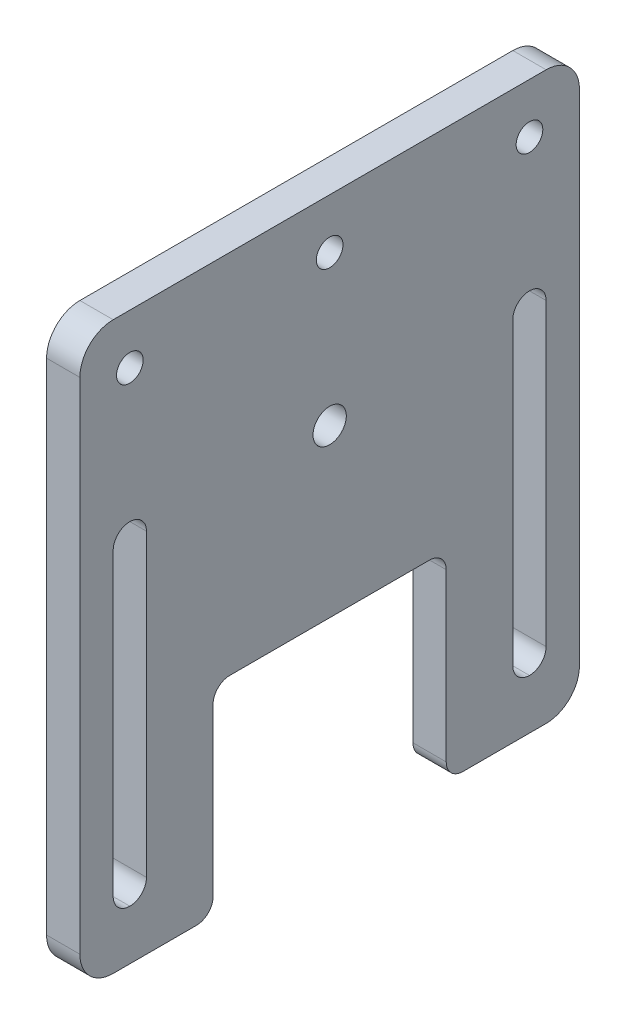
ISO-10303-21;
HEADER;
FILE_DESCRIPTION(('STEP AP214'),'2;1');
FILE_NAME('part.step','',(''),(''),'','','');
FILE_SCHEMA(('AUTOMOTIVE_DESIGN { 1 0 10303 214 1 1 1 1 }'));
ENDSEC;
DATA;
#1=APPLICATION_CONTEXT('core data for automotive mechanical design processes');
#2=APPLICATION_PROTOCOL_DEFINITION('international standard','automotive_design',2000,#1);
#3=PRODUCT_CONTEXT('',#1,'mechanical');
#4=PRODUCT('Part','Part','',(#3));
#5=PRODUCT_RELATED_PRODUCT_CATEGORY('part','',(#4));
#6=PRODUCT_DEFINITION_FORMATION('','',#4);
#7=PRODUCT_DEFINITION_CONTEXT('part definition',#1,'design');
#8=PRODUCT_DEFINITION('design','',#6,#7);
#9=PRODUCT_DEFINITION_SHAPE('','',#8);
#10=(LENGTH_UNIT() NAMED_UNIT(*) SI_UNIT(.MILLI.,.METRE.));
#11=(NAMED_UNIT(*) PLANE_ANGLE_UNIT() SI_UNIT($,.RADIAN.));
#12=(NAMED_UNIT(*) SI_UNIT($,.STERADIAN.) SOLID_ANGLE_UNIT());
#13=UNCERTAINTY_MEASURE_WITH_UNIT(LENGTH_MEASURE(1.E-05),#10,'distance_accuracy_value','');
#14=(GEOMETRIC_REPRESENTATION_CONTEXT(3) GLOBAL_UNCERTAINTY_ASSIGNED_CONTEXT((#13)) GLOBAL_UNIT_ASSIGNED_CONTEXT((#10,
#11,#12)) REPRESENTATION_CONTEXT('',''));
#15=CARTESIAN_POINT('',(0.,0.,0.));
#16=DIRECTION('',(0.,0.,1.));
#17=DIRECTION('',(1.,0.,0.));
#18=AXIS2_PLACEMENT_3D('',#15,#16,#17);
#19=CARTESIAN_POINT('',(10.,-85.,75.));
#20=DIRECTION('',(0.,1.,0.));
#21=DIRECTION('',(0.,0.,1.));
#22=AXIS2_PLACEMENT_3D('',#19,#20,#21);
#23=PLANE('',#22);
#24=DIRECTION('',(0.,0.,-1.));
#25=VECTOR('',#24,1.);
#26=CARTESIAN_POINT('',(0.,-85.,75.));
#27=LINE('',#26,#25);
#28=CARTESIAN_POINT('',(0.,-85.,-40.));
#29=VERTEX_POINT('',#28);
#30=CARTESIAN_POINT('',(0.,-85.,-65.));
#31=VERTEX_POINT('',#30);
#32=EDGE_CURVE('E299',#29,#31,#27,.T.);
#33=ORIENTED_EDGE('',*,*,#32,.T.);
#34=DIRECTION('',(-1.,0.,0.));
#35=VECTOR('',#34,1.);
#36=CARTESIAN_POINT('',(10.,-85.,-65.));
#37=LINE('',#36,#35);
#38=CARTESIAN_POINT('',(10.,-85.,-65.));
#39=VERTEX_POINT('',#38);
#40=EDGE_CURVE('E428',#31,#39,#37,.F.);
#41=ORIENTED_EDGE('',*,*,#40,.T.);
#42=DIRECTION('',(0.,0.,-1.));
#43=VECTOR('',#42,1.);
#44=CARTESIAN_POINT('',(10.,-85.,75.));
#45=LINE('',#44,#43);
#46=CARTESIAN_POINT('',(10.,-85.,-40.));
#47=VERTEX_POINT('',#46);
#48=EDGE_CURVE('E286',#47,#39,#45,.T.);
#49=ORIENTED_EDGE('',*,*,#48,.F.);
#50=DIRECTION('',(-1.,0.,0.));
#51=VECTOR('',#50,1.);
#52=CARTESIAN_POINT('',(10.,-85.,-40.));
#53=LINE('',#52,#51);
#54=EDGE_CURVE('E243',#47,#29,#53,.T.);
#55=ORIENTED_EDGE('',*,*,#54,.T.);
#56=EDGE_LOOP('',(#33,#41,#49,#55));
#57=FACE_BOUND('',#56,.T.);
#58=ADVANCED_FACE('F39',(#57),#23,.F.);
#59=CARTESIAN_POINT('',(10.,-85.,-75.));
#60=DIRECTION('',(0.,0.,1.));
#61=DIRECTION('',(1.,0.,0.));
#62=AXIS2_PLACEMENT_3D('',#59,#60,#61);
#63=PLANE('',#62);
#64=DIRECTION('',(0.,1.,0.));
#65=VECTOR('',#64,1.);
#66=CARTESIAN_POINT('',(10.,-85.,-75.));
#67=LINE('',#66,#65);
#68=CARTESIAN_POINT('',(10.,-75.,-75.));
#69=VERTEX_POINT('',#68);
#70=CARTESIAN_POINT('',(10.,75.,-75.));
#71=VERTEX_POINT('',#70);
#72=EDGE_CURVE('E279',#69,#71,#67,.T.);
#73=ORIENTED_EDGE('',*,*,#72,.F.);
#74=DIRECTION('',(-1.,0.,0.));
#75=VECTOR('',#74,1.);
#76=CARTESIAN_POINT('',(10.,-75.,-75.));
#77=LINE('',#76,#75);
#78=CARTESIAN_POINT('',(0.,-75.,-75.));
#79=VERTEX_POINT('',#78);
#80=EDGE_CURVE('E425',#69,#79,#77,.T.);
#81=ORIENTED_EDGE('',*,*,#80,.T.);
#82=DIRECTION('',(0.,1.,0.));
#83=VECTOR('',#82,1.);
#84=CARTESIAN_POINT('',(0.,-85.,-75.));
#85=LINE('',#84,#83);
#86=CARTESIAN_POINT('',(0.,75.,-75.));
#87=VERTEX_POINT('',#86);
#88=EDGE_CURVE('E290',#79,#87,#85,.T.);
#89=ORIENTED_EDGE('',*,*,#88,.T.);
#90=DIRECTION('',(-1.,0.,0.));
#91=VECTOR('',#90,1.);
#92=CARTESIAN_POINT('',(10.,75.,-75.));
#93=LINE('',#92,#91);
#94=EDGE_CURVE('E423',#87,#71,#93,.F.);
#95=ORIENTED_EDGE('',*,*,#94,.T.);
#96=EDGE_LOOP('',(#73,#81,#89,#95));
#97=FACE_BOUND('',#96,.T.);
#98=ADVANCED_FACE('F440',(#97),#63,.F.);
#99=CARTESIAN_POINT('',(10.,85.,75.));
#100=DIRECTION('',(0.,-1.,0.));
#101=DIRECTION('',(0.,0.,-1.));
#102=AXIS2_PLACEMENT_3D('',#99,#100,#101);
#103=PLANE('',#102);
#104=DIRECTION('',(0.,0.,1.));
#105=VECTOR('',#104,1.);
#106=CARTESIAN_POINT('',(10.,85.,75.));
#107=LINE('',#106,#105);
#108=CARTESIAN_POINT('',(10.,85.,-65.));
#109=VERTEX_POINT('',#108);
#110=CARTESIAN_POINT('',(10.,85.,65.));
#111=VERTEX_POINT('',#110);
#112=EDGE_CURVE('E281',#109,#111,#107,.T.);
#113=ORIENTED_EDGE('',*,*,#112,.F.);
#114=DIRECTION('',(-1.,0.,0.));
#115=VECTOR('',#114,1.);
#116=CARTESIAN_POINT('',(10.,85.,-65.));
#117=LINE('',#116,#115);
#118=CARTESIAN_POINT('',(0.,85.,-65.));
#119=VERTEX_POINT('',#118);
#120=EDGE_CURVE('E11',#109,#119,#117,.T.);
#121=ORIENTED_EDGE('',*,*,#120,.T.);
#122=DIRECTION('',(0.,0.,1.));
#123=VECTOR('',#122,1.);
#124=CARTESIAN_POINT('',(0.,85.,75.));
#125=LINE('',#124,#123);
#126=CARTESIAN_POINT('',(0.,85.,65.));
#127=VERTEX_POINT('',#126);
#128=EDGE_CURVE('E293',#119,#127,#125,.T.);
#129=ORIENTED_EDGE('',*,*,#128,.T.);
#130=DIRECTION('',(-1.,0.,0.));
#131=VECTOR('',#130,1.);
#132=CARTESIAN_POINT('',(10.,85.,65.));
#133=LINE('',#132,#131);
#134=EDGE_CURVE('E47',#127,#111,#133,.F.);
#135=ORIENTED_EDGE('',*,*,#134,.T.);
#136=EDGE_LOOP('',(#113,#121,#129,#135));
#137=FACE_BOUND('',#136,.T.);
#138=ADVANCED_FACE('F450',(#137),#103,.F.);
#139=CARTESIAN_POINT('',(10.,-85.,75.));
#140=DIRECTION('',(0.,0.,-1.));
#141=DIRECTION('',(-1.,0.,0.));
#142=AXIS2_PLACEMENT_3D('',#139,#140,#141);
#143=PLANE('',#142);
#144=DIRECTION('',(0.,-1.,0.));
#145=VECTOR('',#144,1.);
#146=CARTESIAN_POINT('',(0.,-85.,75.));
#147=LINE('',#146,#145);
#148=CARTESIAN_POINT('',(0.,75.,75.));
#149=VERTEX_POINT('',#148);
#150=CARTESIAN_POINT('',(0.,-75.,75.));
#151=VERTEX_POINT('',#150);
#152=EDGE_CURVE('E296',#149,#151,#147,.T.);
#153=ORIENTED_EDGE('',*,*,#152,.T.);
#154=DIRECTION('',(-1.,0.,0.));
#155=VECTOR('',#154,1.);
#156=CARTESIAN_POINT('',(10.,-75.,75.));
#157=LINE('',#156,#155);
#158=CARTESIAN_POINT('',(10.,-75.,75.));
#159=VERTEX_POINT('',#158);
#160=EDGE_CURVE('E414',#151,#159,#157,.F.);
#161=ORIENTED_EDGE('',*,*,#160,.T.);
#162=DIRECTION('',(0.,-1.,0.));
#163=VECTOR('',#162,1.);
#164=CARTESIAN_POINT('',(10.,-85.,75.));
#165=LINE('',#164,#163);
#166=CARTESIAN_POINT('',(10.,75.,75.));
#167=VERTEX_POINT('',#166);
#168=EDGE_CURVE('E284',#167,#159,#165,.T.);
#169=ORIENTED_EDGE('',*,*,#168,.F.);
#170=DIRECTION('',(-1.,0.,0.));
#171=VECTOR('',#170,1.);
#172=CARTESIAN_POINT('',(10.,75.,75.));
#173=LINE('',#172,#171);
#174=EDGE_CURVE('E411',#167,#149,#173,.T.);
#175=ORIENTED_EDGE('',*,*,#174,.T.);
#176=EDGE_LOOP('',(#153,#161,#169,#175));
#177=FACE_BOUND('',#176,.T.);
#178=ADVANCED_FACE('F457',(#177),#143,.F.);
#179=CARTESIAN_POINT('',(10.,-85.,65.));
#180=VERTEX_POINT('',#179);
#181=CARTESIAN_POINT('',(10.,-85.,40.));
#182=VERTEX_POINT('',#181);
#183=EDGE_CURVE('E287',#180,#182,#45,.T.);
#184=ORIENTED_EDGE('',*,*,#183,.F.);
#185=DIRECTION('',(-1.,0.,0.));
#186=VECTOR('',#185,1.);
#187=CARTESIAN_POINT('',(10.,-85.,65.));
#188=LINE('',#187,#186);
#189=CARTESIAN_POINT('',(0.,-85.,65.));
#190=VERTEX_POINT('',#189);
#191=EDGE_CURVE('E387',#180,#190,#188,.T.);
#192=ORIENTED_EDGE('',*,*,#191,.T.);
#193=CARTESIAN_POINT('',(0.,-85.,40.));
#194=VERTEX_POINT('',#193);
#195=EDGE_CURVE('E282',#190,#194,#27,.T.);
#196=ORIENTED_EDGE('',*,*,#195,.T.);
#197=DIRECTION('',(-1.,0.,0.));
#198=VECTOR('',#197,1.);
#199=CARTESIAN_POINT('',(10.,-85.,40.));
#200=LINE('',#199,#198);
#201=EDGE_CURVE('E257',#182,#194,#200,.T.);
#202=ORIENTED_EDGE('',*,*,#201,.F.);
#203=EDGE_LOOP('',(#184,#192,#196,#202));
#204=FACE_BOUND('',#203,.T.);
#205=ADVANCED_FACE('F466',(#204),#23,.F.);
#206=CARTESIAN_POINT('',(10.,0.,0.));
#207=DIRECTION('',(-1.,0.,0.));
#208=DIRECTION('',(0.,0.,1.));
#209=AXIS2_PLACEMENT_3D('',#206,#207,#208);
#210=PLANE('',#209);
#211=DIRECTION('',(0.,1.,0.));
#212=VECTOR('',#211,1.);
#213=CARTESIAN_POINT('',(10.,30.,65.));
#214=LINE('',#213,#212);
#215=CARTESIAN_POINT('',(10.,-65.,65.));
#216=VERTEX_POINT('',#215);
#217=CARTESIAN_POINT('',(10.,25.,65.));
#218=VERTEX_POINT('',#217);
#219=EDGE_CURVE('E834',#216,#218,#214,.T.);
#220=ORIENTED_EDGE('',*,*,#219,.T.);
#221=CARTESIAN_POINT('',(10.,25.,60.));
#222=DIRECTION('',(-1.,0.,0.));
#223=DIRECTION('',(0.,0.,1.));
#224=AXIS2_PLACEMENT_3D('',#221,#222,#223);
#225=CIRCLE('',#224,5.);
#226=CARTESIAN_POINT('',(10.,30.,60.));
#227=VERTEX_POINT('',#226);
#228=EDGE_CURVE('E377',#218,#227,#225,.T.);
#229=ORIENTED_EDGE('',*,*,#228,.T.);
#230=CARTESIAN_POINT('',(10.,25.,60.));
#231=DIRECTION('',(-1.,0.,0.));
#232=DIRECTION('',(0.,0.,1.));
#233=AXIS2_PLACEMENT_3D('',#230,#231,#232);
#234=CIRCLE('',#233,5.);
#235=CARTESIAN_POINT('',(10.,25.,55.));
#236=VERTEX_POINT('',#235);
#237=EDGE_CURVE('E373',#227,#236,#234,.T.);
#238=ORIENTED_EDGE('',*,*,#237,.T.);
#239=DIRECTION('',(0.,-1.,0.));
#240=VECTOR('',#239,1.);
#241=CARTESIAN_POINT('',(10.,30.,55.));
#242=LINE('',#241,#240);
#243=CARTESIAN_POINT('',(10.,-65.,55.));
#244=VERTEX_POINT('',#243);
#245=EDGE_CURVE('E839',#236,#244,#242,.T.);
#246=ORIENTED_EDGE('',*,*,#245,.T.);
#247=CARTESIAN_POINT('',(10.,-65.,60.));
#248=DIRECTION('',(-1.,0.,0.));
#249=DIRECTION('',(0.,0.,1.));
#250=AXIS2_PLACEMENT_3D('',#247,#248,#249);
#251=CIRCLE('',#250,5.);
#252=CARTESIAN_POINT('',(10.,-70.,60.));
#253=VERTEX_POINT('',#252);
#254=EDGE_CURVE('E385',#244,#253,#251,.T.);
#255=ORIENTED_EDGE('',*,*,#254,.T.);
#256=CARTESIAN_POINT('',(10.,-65.,60.));
#257=DIRECTION('',(-1.,0.,0.));
#258=DIRECTION('',(0.,0.,1.));
#259=AXIS2_PLACEMENT_3D('',#256,#257,#258);
#260=CIRCLE('',#259,5.);
#261=EDGE_CURVE('E381',#253,#216,#260,.T.);
#262=ORIENTED_EDGE('',*,*,#261,.T.);
#263=EDGE_LOOP('',(#220,#229,#238,#246,#255,#262));
#264=FACE_BOUND('',#263,.T.);
#265=CARTESIAN_POINT('',(10.,25.,0.));
#266=DIRECTION('',(-1.,0.,0.));
#267=DIRECTION('',(0.,0.,1.));
#268=AXIS2_PLACEMENT_3D('',#265,#266,#267);
#269=CIRCLE('',#268,5.);
#270=CARTESIAN_POINT('',(10.,25.,5.));
#271=VERTEX_POINT('',#270);
#272=EDGE_CURVE('E272',#271,#271,#269,.T.);
#273=ORIENTED_EDGE('',*,*,#272,.T.);
#274=EDGE_LOOP('',(#273));
#275=FACE_BOUND('',#274,.T.);
#276=CARTESIAN_POINT('',(10.,70.,0.));
#277=DIRECTION('',(-1.,0.,0.));
#278=DIRECTION('',(0.,0.,1.));
#279=AXIS2_PLACEMENT_3D('',#276,#277,#278);
#280=CIRCLE('',#279,4.00000000000001);
#281=CARTESIAN_POINT('',(10.,70.,4.));
#282=VERTEX_POINT('',#281);
#283=EDGE_CURVE('E237',#282,#282,#280,.T.);
#284=ORIENTED_EDGE('',*,*,#283,.T.);
#285=EDGE_LOOP('',(#284));
#286=FACE_BOUND('',#285,.T.);
#287=CARTESIAN_POINT('',(10.,70.,60.));
#288=DIRECTION('',(-1.,0.,0.));
#289=DIRECTION('',(0.,0.,1.));
#290=AXIS2_PLACEMENT_3D('',#287,#288,#289);
#291=CIRCLE('',#290,4.00000000000001);
#292=CARTESIAN_POINT('',(10.,70.,64.));
#293=VERTEX_POINT('',#292);
#294=EDGE_CURVE('E812',#293,#293,#291,.T.);
#295=ORIENTED_EDGE('',*,*,#294,.T.);
#296=EDGE_LOOP('',(#295));
#297=FACE_BOUND('',#296,.T.);
#298=DIRECTION('',(0.,-1.,0.));
#299=VECTOR('',#298,1.);
#300=CARTESIAN_POINT('',(10.,30.,-65.));
#301=LINE('',#300,#299);
#302=CARTESIAN_POINT('',(10.,25.,-65.));
#303=VERTEX_POINT('',#302);
#304=CARTESIAN_POINT('',(10.,-65.,-65.));
#305=VERTEX_POINT('',#304);
#306=EDGE_CURVE('E391',#303,#305,#301,.T.);
#307=ORIENTED_EDGE('',*,*,#306,.T.);
#308=CARTESIAN_POINT('',(10.,-65.,-60.));
#309=DIRECTION('',(-1.,0.,0.));
#310=DIRECTION('',(0.,0.,1.));
#311=AXIS2_PLACEMENT_3D('',#308,#309,#310);
#312=CIRCLE('',#311,5.);
#313=CARTESIAN_POINT('',(10.,-70.,-60.));
#314=VERTEX_POINT('',#313);
#315=EDGE_CURVE('E369',#305,#314,#312,.T.);
#316=ORIENTED_EDGE('',*,*,#315,.T.);
#317=CARTESIAN_POINT('',(10.,-65.,-60.));
#318=DIRECTION('',(-1.,0.,0.));
#319=DIRECTION('',(0.,0.,1.));
#320=AXIS2_PLACEMENT_3D('',#317,#318,#319);
#321=CIRCLE('',#320,5.);
#322=CARTESIAN_POINT('',(10.,-65.,-55.));
#323=VERTEX_POINT('',#322);
#324=EDGE_CURVE('E365',#314,#323,#321,.T.);
#325=ORIENTED_EDGE('',*,*,#324,.T.);
#326=DIRECTION('',(0.,1.,0.));
#327=VECTOR('',#326,1.);
#328=CARTESIAN_POINT('',(10.,30.,-55.));
#329=LINE('',#328,#327);
#330=CARTESIAN_POINT('',(10.,25.,-55.));
#331=VERTEX_POINT('',#330);
#332=EDGE_CURVE('E822',#323,#331,#329,.T.);
#333=ORIENTED_EDGE('',*,*,#332,.T.);
#334=CARTESIAN_POINT('',(10.,25.,-60.));
#335=DIRECTION('',(-1.,0.,0.));
#336=DIRECTION('',(0.,0.,1.));
#337=AXIS2_PLACEMENT_3D('',#334,#335,#336);
#338=CIRCLE('',#337,5.);
#339=CARTESIAN_POINT('',(10.,30.,-60.));
#340=VERTEX_POINT('',#339);
#341=EDGE_CURVE('E361',#331,#340,#338,.T.);
#342=ORIENTED_EDGE('',*,*,#341,.T.);
#343=CARTESIAN_POINT('',(10.,25.,-60.));
#344=DIRECTION('',(-1.,0.,0.));
#345=DIRECTION('',(0.,0.,1.));
#346=AXIS2_PLACEMENT_3D('',#343,#344,#345);
#347=CIRCLE('',#346,5.);
#348=EDGE_CURVE('E357',#340,#303,#347,.T.);
#349=ORIENTED_EDGE('',*,*,#348,.T.);
#350=EDGE_LOOP('',(#307,#316,#325,#333,#342,#349));
#351=FACE_BOUND('',#350,.T.);
#352=CARTESIAN_POINT('',(10.,70.,-60.));
#353=DIRECTION('',(-1.,0.,0.));
#354=DIRECTION('',(0.,0.,1.));
#355=AXIS2_PLACEMENT_3D('',#352,#353,#354);
#356=CIRCLE('',#355,4.00000000000001);
#357=CARTESIAN_POINT('',(10.,70.,-56.));
#358=VERTEX_POINT('',#357);
#359=EDGE_CURVE('E246',#358,#358,#356,.T.);
#360=ORIENTED_EDGE('',*,*,#359,.T.);
#361=EDGE_LOOP('',(#360));
#362=FACE_BOUND('',#361,.T.);
#363=ORIENTED_EDGE('',*,*,#168,.T.);
#364=CARTESIAN_POINT('',(10.,-75.,65.));
#365=DIRECTION('',(-1.,0.,0.));
#366=DIRECTION('',(0.,0.,1.));
#367=AXIS2_PLACEMENT_3D('',#364,#365,#366);
#368=CIRCLE('',#367,10.);
#369=EDGE_CURVE('E421',#159,#180,#368,.F.);
#370=ORIENTED_EDGE('',*,*,#369,.T.);
#371=ORIENTED_EDGE('',*,*,#183,.T.);
#372=CARTESIAN_POINT('',(10.,-80.,40.));
#373=DIRECTION('',(1.,0.,0.));
#374=DIRECTION('',(0.,0.,-1.));
#375=AXIS2_PLACEMENT_3D('',#372,#373,#374);
#376=CIRCLE('',#375,5.);
#377=CARTESIAN_POINT('',(10.,-80.,35.));
#378=VERTEX_POINT('',#377);
#379=EDGE_CURVE('E247',#182,#378,#376,.T.);
#380=ORIENTED_EDGE('',*,*,#379,.T.);
#381=DIRECTION('',(0.,1.,0.));
#382=VECTOR('',#381,1.);
#383=CARTESIAN_POINT('',(10.,-80.,35.));
#384=LINE('',#383,#382);
#385=CARTESIAN_POINT('',(10.,-30.,35.));
#386=VERTEX_POINT('',#385);
#387=EDGE_CURVE('E265',#378,#386,#384,.T.);
#388=ORIENTED_EDGE('',*,*,#387,.T.);
#389=CARTESIAN_POINT('',(10.,-30.,30.));
#390=DIRECTION('',(-1.,0.,0.));
#391=DIRECTION('',(0.,0.,1.));
#392=AXIS2_PLACEMENT_3D('',#389,#390,#391);
#393=CIRCLE('',#392,5.00000000000001);
#394=CARTESIAN_POINT('',(10.,-25.,30.));
#395=VERTEX_POINT('',#394);
#396=EDGE_CURVE('E262',#386,#395,#393,.T.);
#397=ORIENTED_EDGE('',*,*,#396,.T.);
#398=DIRECTION('',(0.,0.,-1.));
#399=VECTOR('',#398,1.);
#400=CARTESIAN_POINT('',(10.,-25.,-30.));
#401=LINE('',#400,#399);
#402=CARTESIAN_POINT('',(10.,-25.,-30.));
#403=VERTEX_POINT('',#402);
#404=EDGE_CURVE('E255',#395,#403,#401,.T.);
#405=ORIENTED_EDGE('',*,*,#404,.T.);
#406=CARTESIAN_POINT('',(10.,-30.,-30.));
#407=DIRECTION('',(-1.,0.,0.));
#408=DIRECTION('',(0.,0.,-1.));
#409=AXIS2_PLACEMENT_3D('',#406,#407,#408);
#410=CIRCLE('',#409,5.);
#411=CARTESIAN_POINT('',(10.,-30.,-35.));
#412=VERTEX_POINT('',#411);
#413=EDGE_CURVE('E253',#403,#412,#410,.T.);
#414=ORIENTED_EDGE('',*,*,#413,.T.);
#415=DIRECTION('',(0.,-1.,0.));
#416=VECTOR('',#415,1.);
#417=CARTESIAN_POINT('',(10.,-80.,-35.));
#418=LINE('',#417,#416);
#419=CARTESIAN_POINT('',(10.,-80.,-35.));
#420=VERTEX_POINT('',#419);
#421=EDGE_CURVE('E230',#412,#420,#418,.T.);
#422=ORIENTED_EDGE('',*,*,#421,.T.);
#423=CARTESIAN_POINT('',(10.,-80.,-40.));
#424=DIRECTION('',(1.,0.,0.));
#425=DIRECTION('',(0.,0.,1.));
#426=AXIS2_PLACEMENT_3D('',#423,#424,#425);
#427=CIRCLE('',#426,5.);
#428=EDGE_CURVE('E240',#420,#47,#427,.T.);
#429=ORIENTED_EDGE('',*,*,#428,.T.);
#430=ORIENTED_EDGE('',*,*,#48,.T.);
#431=CARTESIAN_POINT('',(10.,-75.,-65.));
#432=DIRECTION('',(-1.,0.,0.));
#433=DIRECTION('',(0.,0.,1.));
#434=AXIS2_PLACEMENT_3D('',#431,#432,#433);
#435=CIRCLE('',#434,10.);
#436=EDGE_CURVE('E419',#39,#69,#435,.F.);
#437=ORIENTED_EDGE('',*,*,#436,.T.);
#438=ORIENTED_EDGE('',*,*,#72,.T.);
#439=CARTESIAN_POINT('',(10.,75.,-65.));
#440=DIRECTION('',(-1.,0.,0.));
#441=DIRECTION('',(0.,0.,1.));
#442=AXIS2_PLACEMENT_3D('',#439,#440,#441);
#443=CIRCLE('',#442,10.);
#444=EDGE_CURVE('E60',#71,#109,#443,.F.);
#445=ORIENTED_EDGE('',*,*,#444,.T.);
#446=ORIENTED_EDGE('',*,*,#112,.T.);
#447=CARTESIAN_POINT('',(10.,75.,65.));
#448=DIRECTION('',(-1.,0.,0.));
#449=DIRECTION('',(0.,0.,1.));
#450=AXIS2_PLACEMENT_3D('',#447,#448,#449);
#451=CIRCLE('',#450,10.);
#452=EDGE_CURVE('E416',#111,#167,#451,.F.);
#453=ORIENTED_EDGE('',*,*,#452,.T.);
#454=EDGE_LOOP('',(#363,#370,#371,#380,#388,#397,#405,#414,#422,#429,#430,#437,#438,#445,#446,#453));
#455=FACE_BOUND('',#454,.T.);
#456=ADVANCED_FACE('F250',(#264,#275,#286,#297,#351,#362,#455),#210,.F.);
#457=CARTESIAN_POINT('',(0.,0.,0.));
#458=DIRECTION('',(-1.,0.,0.));
#459=DIRECTION('',(0.,0.,1.));
#460=AXIS2_PLACEMENT_3D('',#457,#458,#459);
#461=PLANE('',#460);
#462=CARTESIAN_POINT('',(0.,25.,60.));
#463=DIRECTION('',(-1.,0.,0.));
#464=DIRECTION('',(0.,0.,1.));
#465=AXIS2_PLACEMENT_3D('',#462,#463,#464);
#466=CIRCLE('',#465,5.);
#467=CARTESIAN_POINT('',(0.,25.,55.));
#468=VERTEX_POINT('',#467);
#469=CARTESIAN_POINT('',(0.,30.,60.));
#470=VERTEX_POINT('',#469);
#471=EDGE_CURVE('E371',#468,#470,#466,.F.);
#472=ORIENTED_EDGE('',*,*,#471,.T.);
#473=CARTESIAN_POINT('',(0.,25.,60.));
#474=DIRECTION('',(-1.,0.,0.));
#475=DIRECTION('',(0.,0.,1.));
#476=AXIS2_PLACEMENT_3D('',#473,#474,#475);
#477=CIRCLE('',#476,5.);
#478=CARTESIAN_POINT('',(0.,25.,65.));
#479=VERTEX_POINT('',#478);
#480=EDGE_CURVE('E375',#470,#479,#477,.F.);
#481=ORIENTED_EDGE('',*,*,#480,.T.);
#482=DIRECTION('',(0.,1.,0.));
#483=VECTOR('',#482,1.);
#484=CARTESIAN_POINT('',(0.,0.,65.));
#485=LINE('',#484,#483);
#486=CARTESIAN_POINT('',(0.,-65.,65.));
#487=VERTEX_POINT('',#486);
#488=EDGE_CURVE('E317',#487,#479,#485,.T.);
#489=ORIENTED_EDGE('',*,*,#488,.F.);
#490=CARTESIAN_POINT('',(0.,-65.,60.));
#491=DIRECTION('',(-1.,0.,0.));
#492=DIRECTION('',(0.,0.,1.));
#493=AXIS2_PLACEMENT_3D('',#490,#491,#492);
#494=CIRCLE('',#493,5.);
#495=CARTESIAN_POINT('',(0.,-70.,60.));
#496=VERTEX_POINT('',#495);
#497=EDGE_CURVE('E379',#487,#496,#494,.F.);
#498=ORIENTED_EDGE('',*,*,#497,.T.);
#499=CARTESIAN_POINT('',(0.,-65.,60.));
#500=DIRECTION('',(-1.,0.,0.));
#501=DIRECTION('',(0.,0.,1.));
#502=AXIS2_PLACEMENT_3D('',#499,#500,#501);
#503=CIRCLE('',#502,5.);
#504=CARTESIAN_POINT('',(0.,-65.,55.));
#505=VERTEX_POINT('',#504);
#506=EDGE_CURVE('E383',#496,#505,#503,.F.);
#507=ORIENTED_EDGE('',*,*,#506,.T.);
#508=DIRECTION('',(0.,-1.,0.));
#509=VECTOR('',#508,1.);
#510=CARTESIAN_POINT('',(0.,0.,55.));
#511=LINE('',#510,#509);
#512=EDGE_CURVE('E320',#468,#505,#511,.T.);
#513=ORIENTED_EDGE('',*,*,#512,.F.);
#514=EDGE_LOOP('',(#472,#481,#489,#498,#507,#513));
#515=FACE_BOUND('',#514,.T.);
#516=CARTESIAN_POINT('',(0.,25.,0.));
#517=DIRECTION('',(-1.,0.,0.));
#518=DIRECTION('',(0.,0.,1.));
#519=AXIS2_PLACEMENT_3D('',#516,#517,#518);
#520=CIRCLE('',#519,5.);
#521=CARTESIAN_POINT('',(0.,25.,5.));
#522=VERTEX_POINT('',#521);
#523=EDGE_CURVE('E294',#522,#522,#520,.T.);
#524=ORIENTED_EDGE('',*,*,#523,.F.);
#525=EDGE_LOOP('',(#524));
#526=FACE_BOUND('',#525,.T.);
#527=CARTESIAN_POINT('',(0.,70.,0.));
#528=DIRECTION('',(-1.,0.,0.));
#529=DIRECTION('',(0.,0.,1.));
#530=AXIS2_PLACEMENT_3D('',#527,#528,#529);
#531=CIRCLE('',#530,4.00000000000001);
#532=CARTESIAN_POINT('',(0.,70.,4.));
#533=VERTEX_POINT('',#532);
#534=EDGE_CURVE('E312',#533,#533,#531,.T.);
#535=ORIENTED_EDGE('',*,*,#534,.F.);
#536=EDGE_LOOP('',(#535));
#537=FACE_BOUND('',#536,.T.);
#538=ORIENTED_EDGE('',*,*,#195,.F.);
#539=CARTESIAN_POINT('',(0.,-75.,65.));
#540=DIRECTION('',(-1.,0.,0.));
#541=DIRECTION('',(0.,0.,1.));
#542=AXIS2_PLACEMENT_3D('',#539,#540,#541);
#543=CIRCLE('',#542,10.);
#544=EDGE_CURVE('E409',#190,#151,#543,.T.);
#545=ORIENTED_EDGE('',*,*,#544,.T.);
#546=ORIENTED_EDGE('',*,*,#152,.F.);
#547=CARTESIAN_POINT('',(0.,75.,65.));
#548=DIRECTION('',(-1.,0.,0.));
#549=DIRECTION('',(0.,0.,1.));
#550=AXIS2_PLACEMENT_3D('',#547,#548,#549);
#551=CIRCLE('',#550,10.);
#552=EDGE_CURVE('E403',#149,#127,#551,.T.);
#553=ORIENTED_EDGE('',*,*,#552,.T.);
#554=ORIENTED_EDGE('',*,*,#128,.F.);
#555=CARTESIAN_POINT('',(0.,75.,-65.));
#556=DIRECTION('',(-1.,0.,0.));
#557=DIRECTION('',(0.,0.,1.));
#558=AXIS2_PLACEMENT_3D('',#555,#556,#557);
#559=CIRCLE('',#558,10.);
#560=EDGE_CURVE('E405',#119,#87,#559,.T.);
#561=ORIENTED_EDGE('',*,*,#560,.T.);
#562=ORIENTED_EDGE('',*,*,#88,.F.);
#563=CARTESIAN_POINT('',(0.,-75.,-65.));
#564=DIRECTION('',(-1.,0.,0.));
#565=DIRECTION('',(0.,0.,1.));
#566=AXIS2_PLACEMENT_3D('',#563,#564,#565);
#567=CIRCLE('',#566,10.);
#568=EDGE_CURVE('E407',#79,#31,#567,.T.);
#569=ORIENTED_EDGE('',*,*,#568,.T.);
#570=ORIENTED_EDGE('',*,*,#32,.F.);
#571=CARTESIAN_POINT('',(0.,-80.,-40.));
#572=DIRECTION('',(-1.,0.,0.));
#573=DIRECTION('',(0.,0.,1.));
#574=AXIS2_PLACEMENT_3D('',#571,#572,#573);
#575=CIRCLE('',#574,5.);
#576=CARTESIAN_POINT('',(0.,-80.,-35.));
#577=VERTEX_POINT('',#576);
#578=EDGE_CURVE('E321',#577,#29,#575,.F.);
#579=ORIENTED_EDGE('',*,*,#578,.F.);
#580=DIRECTION('',(0.,1.,0.));
#581=VECTOR('',#580,1.);
#582=CARTESIAN_POINT('',(0.,-80.,-35.));
#583=LINE('',#582,#581);
#584=CARTESIAN_POINT('',(0.,-30.,-35.));
#585=VERTEX_POINT('',#584);
#586=EDGE_CURVE('E233',#585,#577,#583,.F.);
#587=ORIENTED_EDGE('',*,*,#586,.F.);
#588=CARTESIAN_POINT('',(0.,-30.,-30.));
#589=DIRECTION('',(-1.,0.,0.));
#590=DIRECTION('',(0.,0.,1.));
#591=AXIS2_PLACEMENT_3D('',#588,#589,#590);
#592=CIRCLE('',#591,5.);
#593=CARTESIAN_POINT('',(0.,-25.,-30.));
#594=VERTEX_POINT('',#593);
#595=EDGE_CURVE('E332',#594,#585,#592,.T.);
#596=ORIENTED_EDGE('',*,*,#595,.F.);
#597=DIRECTION('',(0.,0.,1.));
#598=VECTOR('',#597,1.);
#599=CARTESIAN_POINT('',(0.,-25.,-30.));
#600=LINE('',#599,#598);
#601=CARTESIAN_POINT('',(0.,-25.,30.));
#602=VERTEX_POINT('',#601);
#603=EDGE_CURVE('E330',#602,#594,#600,.F.);
#604=ORIENTED_EDGE('',*,*,#603,.F.);
#605=CARTESIAN_POINT('',(0.,-30.,30.));
#606=DIRECTION('',(-1.,0.,0.));
#607=DIRECTION('',(0.,0.,1.));
#608=AXIS2_PLACEMENT_3D('',#605,#606,#607);
#609=CIRCLE('',#608,5.00000000000001);
#610=CARTESIAN_POINT('',(0.,-30.,35.));
#611=VERTEX_POINT('',#610);
#612=EDGE_CURVE('E328',#611,#602,#609,.T.);
#613=ORIENTED_EDGE('',*,*,#612,.F.);
#614=DIRECTION('',(0.,-1.,0.));
#615=VECTOR('',#614,1.);
#616=CARTESIAN_POINT('',(0.,-80.,35.));
#617=LINE('',#616,#615);
#618=CARTESIAN_POINT('',(0.,-80.,35.));
#619=VERTEX_POINT('',#618);
#620=EDGE_CURVE('E326',#619,#611,#617,.F.);
#621=ORIENTED_EDGE('',*,*,#620,.F.);
#622=CARTESIAN_POINT('',(0.,-80.,40.));
#623=DIRECTION('',(-1.,0.,0.));
#624=DIRECTION('',(0.,0.,1.));
#625=AXIS2_PLACEMENT_3D('',#622,#623,#624);
#626=CIRCLE('',#625,5.);
#627=EDGE_CURVE('E309',#194,#619,#626,.F.);
#628=ORIENTED_EDGE('',*,*,#627,.F.);
#629=EDGE_LOOP('',(#538,#545,#546,#553,#554,#561,#562,#569,#570,#579,#587,#596,#604,#613,#621,#628));
#630=FACE_BOUND('',#629,.T.);
#631=CARTESIAN_POINT('',(0.,70.,60.));
#632=DIRECTION('',(-1.,0.,0.));
#633=DIRECTION('',(0.,0.,1.));
#634=AXIS2_PLACEMENT_3D('',#631,#632,#633);
#635=CIRCLE('',#634,4.00000000000001);
#636=CARTESIAN_POINT('',(0.,70.,64.));
#637=VERTEX_POINT('',#636);
#638=EDGE_CURVE('E303',#637,#637,#635,.T.);
#639=ORIENTED_EDGE('',*,*,#638,.F.);
#640=EDGE_LOOP('',(#639));
#641=FACE_BOUND('',#640,.T.);
#642=CARTESIAN_POINT('',(0.,-65.,-60.));
#643=DIRECTION('',(-1.,0.,0.));
#644=DIRECTION('',(0.,0.,1.));
#645=AXIS2_PLACEMENT_3D('',#642,#643,#644);
#646=CIRCLE('',#645,5.);
#647=CARTESIAN_POINT('',(0.,-65.,-55.));
#648=VERTEX_POINT('',#647);
#649=CARTESIAN_POINT('',(0.,-70.,-60.));
#650=VERTEX_POINT('',#649);
#651=EDGE_CURVE('E363',#648,#650,#646,.F.);
#652=ORIENTED_EDGE('',*,*,#651,.T.);
#653=CARTESIAN_POINT('',(0.,-65.,-60.));
#654=DIRECTION('',(-1.,0.,0.));
#655=DIRECTION('',(0.,0.,1.));
#656=AXIS2_PLACEMENT_3D('',#653,#654,#655);
#657=CIRCLE('',#656,5.);
#658=CARTESIAN_POINT('',(0.,-65.,-65.));
#659=VERTEX_POINT('',#658);
#660=EDGE_CURVE('E367',#650,#659,#657,.F.);
#661=ORIENTED_EDGE('',*,*,#660,.T.);
#662=DIRECTION('',(0.,-1.,0.));
#663=VECTOR('',#662,1.);
#664=CARTESIAN_POINT('',(0.,0.,-65.));
#665=LINE('',#664,#663);
#666=CARTESIAN_POINT('',(0.,25.,-65.));
#667=VERTEX_POINT('',#666);
#668=EDGE_CURVE('E289',#667,#659,#665,.T.);
#669=ORIENTED_EDGE('',*,*,#668,.F.);
#670=CARTESIAN_POINT('',(0.,25.,-60.));
#671=DIRECTION('',(-1.,0.,0.));
#672=DIRECTION('',(0.,0.,1.));
#673=AXIS2_PLACEMENT_3D('',#670,#671,#672);
#674=CIRCLE('',#673,5.);
#675=CARTESIAN_POINT('',(0.,30.,-60.));
#676=VERTEX_POINT('',#675);
#677=EDGE_CURVE('E355',#667,#676,#674,.F.);
#678=ORIENTED_EDGE('',*,*,#677,.T.);
#679=CARTESIAN_POINT('',(0.,25.,-60.));
#680=DIRECTION('',(-1.,0.,0.));
#681=DIRECTION('',(0.,0.,1.));
#682=AXIS2_PLACEMENT_3D('',#679,#680,#681);
#683=CIRCLE('',#682,5.);
#684=CARTESIAN_POINT('',(0.,25.,-55.));
#685=VERTEX_POINT('',#684);
#686=EDGE_CURVE('E359',#676,#685,#683,.F.);
#687=ORIENTED_EDGE('',*,*,#686,.T.);
#688=DIRECTION('',(0.,1.,0.));
#689=VECTOR('',#688,1.);
#690=CARTESIAN_POINT('',(0.,0.,-55.));
#691=LINE('',#690,#689);
#692=EDGE_CURVE('E306',#648,#685,#691,.T.);
#693=ORIENTED_EDGE('',*,*,#692,.F.);
#694=EDGE_LOOP('',(#652,#661,#669,#678,#687,#693));
#695=FACE_BOUND('',#694,.T.);
#696=CARTESIAN_POINT('',(0.,70.,-60.));
#697=DIRECTION('',(-1.,0.,0.));
#698=DIRECTION('',(0.,0.,1.));
#699=AXIS2_PLACEMENT_3D('',#696,#697,#698);
#700=CIRCLE('',#699,4.00000000000001);
#701=CARTESIAN_POINT('',(0.,70.,-56.));
#702=VERTEX_POINT('',#701);
#703=EDGE_CURVE('E274',#702,#702,#700,.T.);
#704=ORIENTED_EDGE('',*,*,#703,.F.);
#705=EDGE_LOOP('',(#704));
#706=FACE_BOUND('',#705,.T.);
#707=ADVANCED_FACE('F444',(#515,#526,#537,#630,#641,#695,#706),#461,.T.);
#708=CARTESIAN_POINT('',(10.,70.,-60.));
#709=DIRECTION('',(-1.,0.,0.));
#710=DIRECTION('',(0.,0.,1.));
#711=AXIS2_PLACEMENT_3D('',#708,#709,#710);
#712=CYLINDRICAL_SURFACE('',#711,4.00000000000001);
#713=ORIENTED_EDGE('',*,*,#703,.T.);
#714=EDGE_LOOP('',(#713));
#715=FACE_BOUND('',#714,.T.);
#716=ORIENTED_EDGE('',*,*,#359,.F.);
#717=EDGE_LOOP('',(#716));
#718=FACE_BOUND('',#717,.T.);
#719=ADVANCED_FACE('F750',(#715,#718),#712,.F.);
#720=CARTESIAN_POINT('',(10.,30.,-55.));
#721=DIRECTION('',(0.,0.,1.));
#722=DIRECTION('',(0.,-1.,0.));
#723=AXIS2_PLACEMENT_3D('',#720,#721,#722);
#724=PLANE('',#723);
#725=ORIENTED_EDGE('',*,*,#692,.T.);
#726=DIRECTION('',(-1.,0.,0.));
#727=VECTOR('',#726,1.);
#728=CARTESIAN_POINT('',(10.,25.,-55.));
#729=LINE('',#728,#727);
#730=EDGE_CURVE('E343',#685,#331,#729,.F.);
#731=ORIENTED_EDGE('',*,*,#730,.T.);
#732=ORIENTED_EDGE('',*,*,#332,.F.);
#733=DIRECTION('',(-1.,0.,0.));
#734=VECTOR('',#733,1.);
#735=CARTESIAN_POINT('',(0.,-65.,-55.));
#736=LINE('',#735,#734);
#737=EDGE_CURVE('E340',#323,#648,#736,.T.);
#738=ORIENTED_EDGE('',*,*,#737,.T.);
#739=EDGE_LOOP('',(#725,#731,#732,#738));
#740=FACE_BOUND('',#739,.T.);
#741=ADVANCED_FACE('F741',(#740),#724,.F.);
#742=CARTESIAN_POINT('',(10.,30.,-65.));
#743=DIRECTION('',(0.,0.,-1.));
#744=DIRECTION('',(0.,1.,0.));
#745=AXIS2_PLACEMENT_3D('',#742,#743,#744);
#746=PLANE('',#745);
#747=ORIENTED_EDGE('',*,*,#306,.F.);
#748=DIRECTION('',(-1.,0.,0.));
#749=VECTOR('',#748,1.);
#750=CARTESIAN_POINT('',(0.,25.,-65.));
#751=LINE('',#750,#749);
#752=EDGE_CURVE('E337',#303,#667,#751,.T.);
#753=ORIENTED_EDGE('',*,*,#752,.T.);
#754=ORIENTED_EDGE('',*,*,#668,.T.);
#755=DIRECTION('',(-1.,0.,0.));
#756=VECTOR('',#755,1.);
#757=CARTESIAN_POINT('',(10.,-65.,-65.));
#758=LINE('',#757,#756);
#759=EDGE_CURVE('E324',#659,#305,#758,.F.);
#760=ORIENTED_EDGE('',*,*,#759,.T.);
#761=EDGE_LOOP('',(#747,#753,#754,#760));
#762=FACE_BOUND('',#761,.T.);
#763=ADVANCED_FACE('F731',(#762),#746,.F.);
#764=CARTESIAN_POINT('',(10.,70.,60.));
#765=DIRECTION('',(-1.,0.,0.));
#766=DIRECTION('',(0.,0.,1.));
#767=AXIS2_PLACEMENT_3D('',#764,#765,#766);
#768=CYLINDRICAL_SURFACE('',#767,4.00000000000001);
#769=ORIENTED_EDGE('',*,*,#638,.T.);
#770=EDGE_LOOP('',(#769));
#771=FACE_BOUND('',#770,.T.);
#772=ORIENTED_EDGE('',*,*,#294,.F.);
#773=EDGE_LOOP('',(#772));
#774=FACE_BOUND('',#773,.T.);
#775=ADVANCED_FACE('F722',(#771,#774),#768,.F.);
#776=CARTESIAN_POINT('',(10.,-80.,-40.));
#777=DIRECTION('',(-1.,0.,0.));
#778=DIRECTION('',(0.,0.,1.));
#779=AXIS2_PLACEMENT_3D('',#776,#777,#778);
#780=CYLINDRICAL_SURFACE('',#779,5.);
#781=ORIENTED_EDGE('',*,*,#578,.T.);
#782=ORIENTED_EDGE('',*,*,#54,.F.);
#783=ORIENTED_EDGE('',*,*,#428,.F.);
#784=DIRECTION('',(-1.,0.,0.));
#785=VECTOR('',#784,1.);
#786=CARTESIAN_POINT('',(10.,-80.,-35.));
#787=LINE('',#786,#785);
#788=EDGE_CURVE('E225',#420,#577,#787,.T.);
#789=ORIENTED_EDGE('',*,*,#788,.T.);
#790=EDGE_LOOP('',(#781,#782,#783,#789));
#791=FACE_BOUND('',#790,.T.);
#792=ADVANCED_FACE('F241',(#791),#780,.T.);
#793=CARTESIAN_POINT('',(10.,-80.,-35.));
#794=DIRECTION('',(0.,0.,-1.));
#795=DIRECTION('',(0.,1.,0.));
#796=AXIS2_PLACEMENT_3D('',#793,#794,#795);
#797=PLANE('',#796);
#798=ORIENTED_EDGE('',*,*,#586,.T.);
#799=ORIENTED_EDGE('',*,*,#788,.F.);
#800=ORIENTED_EDGE('',*,*,#421,.F.);
#801=DIRECTION('',(-1.,0.,0.));
#802=VECTOR('',#801,1.);
#803=CARTESIAN_POINT('',(10.,-30.,-35.));
#804=LINE('',#803,#802);
#805=EDGE_CURVE('E236',#412,#585,#804,.T.);
#806=ORIENTED_EDGE('',*,*,#805,.T.);
#807=EDGE_LOOP('',(#798,#799,#800,#806));
#808=FACE_BOUND('',#807,.T.);
#809=ADVANCED_FACE('F227',(#808),#797,.F.);
#810=CARTESIAN_POINT('',(10.,-30.,-30.));
#811=DIRECTION('',(-1.,0.,0.));
#812=DIRECTION('',(0.,0.,1.));
#813=AXIS2_PLACEMENT_3D('',#810,#811,#812);
#814=CYLINDRICAL_SURFACE('',#813,5.);
#815=ORIENTED_EDGE('',*,*,#595,.T.);
#816=ORIENTED_EDGE('',*,*,#805,.F.);
#817=ORIENTED_EDGE('',*,*,#413,.F.);
#818=DIRECTION('',(-1.,0.,0.));
#819=VECTOR('',#818,1.);
#820=CARTESIAN_POINT('',(10.,-25.,-30.));
#821=LINE('',#820,#819);
#822=EDGE_CURVE('E488',#403,#594,#821,.T.);
#823=ORIENTED_EDGE('',*,*,#822,.T.);
#824=EDGE_LOOP('',(#815,#816,#817,#823));
#825=FACE_BOUND('',#824,.T.);
#826=ADVANCED_FACE('F495',(#825),#814,.F.);
#827=CARTESIAN_POINT('',(10.,-25.,-30.));
#828=DIRECTION('',(0.,1.,0.));
#829=DIRECTION('',(0.,0.,1.));
#830=AXIS2_PLACEMENT_3D('',#827,#828,#829);
#831=PLANE('',#830);
#832=ORIENTED_EDGE('',*,*,#603,.T.);
#833=ORIENTED_EDGE('',*,*,#822,.F.);
#834=ORIENTED_EDGE('',*,*,#404,.F.);
#835=DIRECTION('',(-1.,0.,0.));
#836=VECTOR('',#835,1.);
#837=CARTESIAN_POINT('',(10.,-25.,30.));
#838=LINE('',#837,#836);
#839=EDGE_CURVE('E485',#395,#602,#838,.T.);
#840=ORIENTED_EDGE('',*,*,#839,.T.);
#841=EDGE_LOOP('',(#832,#833,#834,#840));
#842=FACE_BOUND('',#841,.T.);
#843=ADVANCED_FACE('F490',(#842),#831,.F.);
#844=CARTESIAN_POINT('',(10.,-30.,30.));
#845=DIRECTION('',(-1.,0.,0.));
#846=DIRECTION('',(0.,0.,1.));
#847=AXIS2_PLACEMENT_3D('',#844,#845,#846);
#848=CYLINDRICAL_SURFACE('',#847,5.00000000000001);
#849=ORIENTED_EDGE('',*,*,#612,.T.);
#850=ORIENTED_EDGE('',*,*,#839,.F.);
#851=ORIENTED_EDGE('',*,*,#396,.F.);
#852=DIRECTION('',(-1.,0.,0.));
#853=VECTOR('',#852,1.);
#854=CARTESIAN_POINT('',(10.,-30.,35.));
#855=LINE('',#854,#853);
#856=EDGE_CURVE('E475',#386,#611,#855,.T.);
#857=ORIENTED_EDGE('',*,*,#856,.T.);
#858=EDGE_LOOP('',(#849,#850,#851,#857));
#859=FACE_BOUND('',#858,.T.);
#860=ADVANCED_FACE('F482',(#859),#848,.F.);
#861=CARTESIAN_POINT('',(10.,-80.,35.));
#862=DIRECTION('',(0.,0.,1.));
#863=DIRECTION('',(0.,-1.,0.));
#864=AXIS2_PLACEMENT_3D('',#861,#862,#863);
#865=PLANE('',#864);
#866=ORIENTED_EDGE('',*,*,#620,.T.);
#867=ORIENTED_EDGE('',*,*,#856,.F.);
#868=ORIENTED_EDGE('',*,*,#387,.F.);
#869=DIRECTION('',(-1.,0.,0.));
#870=VECTOR('',#869,1.);
#871=CARTESIAN_POINT('',(10.,-80.,35.));
#872=LINE('',#871,#870);
#873=EDGE_CURVE('E278',#378,#619,#872,.T.);
#874=ORIENTED_EDGE('',*,*,#873,.T.);
#875=EDGE_LOOP('',(#866,#867,#868,#874));
#876=FACE_BOUND('',#875,.T.);
#877=ADVANCED_FACE('F477',(#876),#865,.F.);
#878=CARTESIAN_POINT('',(10.,-80.,40.));
#879=DIRECTION('',(-1.,0.,0.));
#880=DIRECTION('',(0.,0.,1.));
#881=AXIS2_PLACEMENT_3D('',#878,#879,#880);
#882=CYLINDRICAL_SURFACE('',#881,5.);
#883=ORIENTED_EDGE('',*,*,#627,.T.);
#884=ORIENTED_EDGE('',*,*,#873,.F.);
#885=ORIENTED_EDGE('',*,*,#379,.F.);
#886=ORIENTED_EDGE('',*,*,#201,.T.);
#887=EDGE_LOOP('',(#883,#884,#885,#886));
#888=FACE_BOUND('',#887,.T.);
#889=ADVANCED_FACE('F470',(#888),#882,.T.);
#890=CARTESIAN_POINT('',(10.,70.,0.));
#891=DIRECTION('',(-1.,0.,0.));
#892=DIRECTION('',(0.,0.,1.));
#893=AXIS2_PLACEMENT_3D('',#890,#891,#892);
#894=CYLINDRICAL_SURFACE('',#893,4.00000000000001);
#895=ORIENTED_EDGE('',*,*,#534,.T.);
#896=EDGE_LOOP('',(#895));
#897=FACE_BOUND('',#896,.T.);
#898=ORIENTED_EDGE('',*,*,#283,.F.);
#899=EDGE_LOOP('',(#898));
#900=FACE_BOUND('',#899,.T.);
#901=ADVANCED_FACE('F662',(#897,#900),#894,.F.);
#902=CARTESIAN_POINT('',(10.,25.,0.));
#903=DIRECTION('',(-1.,0.,0.));
#904=DIRECTION('',(0.,0.,1.));
#905=AXIS2_PLACEMENT_3D('',#902,#903,#904);
#906=CYLINDRICAL_SURFACE('',#905,5.);
#907=ORIENTED_EDGE('',*,*,#523,.T.);
#908=EDGE_LOOP('',(#907));
#909=FACE_BOUND('',#908,.T.);
#910=ORIENTED_EDGE('',*,*,#272,.F.);
#911=EDGE_LOOP('',(#910));
#912=FACE_BOUND('',#911,.T.);
#913=ADVANCED_FACE('F651',(#909,#912),#906,.F.);
#914=CARTESIAN_POINT('',(10.,30.,55.));
#915=DIRECTION('',(0.,0.,-1.));
#916=DIRECTION('',(0.,1.,0.));
#917=AXIS2_PLACEMENT_3D('',#914,#915,#916);
#918=PLANE('',#917);
#919=ORIENTED_EDGE('',*,*,#245,.F.);
#920=DIRECTION('',(-1.,0.,0.));
#921=VECTOR('',#920,1.);
#922=CARTESIAN_POINT('',(0.,25.,55.));
#923=LINE('',#922,#921);
#924=EDGE_CURVE('E347',#236,#468,#923,.T.);
#925=ORIENTED_EDGE('',*,*,#924,.T.);
#926=ORIENTED_EDGE('',*,*,#512,.T.);
#927=DIRECTION('',(-1.,0.,0.));
#928=VECTOR('',#927,1.);
#929=CARTESIAN_POINT('',(10.,-65.,55.));
#930=LINE('',#929,#928);
#931=EDGE_CURVE('E345',#505,#244,#930,.F.);
#932=ORIENTED_EDGE('',*,*,#931,.T.);
#933=EDGE_LOOP('',(#919,#925,#926,#932));
#934=FACE_BOUND('',#933,.T.);
#935=ADVANCED_FACE('F641',(#934),#918,.F.);
#936=CARTESIAN_POINT('',(10.,30.,65.));
#937=DIRECTION('',(0.,0.,1.));
#938=DIRECTION('',(0.,-1.,0.));
#939=AXIS2_PLACEMENT_3D('',#936,#937,#938);
#940=PLANE('',#939);
#941=ORIENTED_EDGE('',*,*,#488,.T.);
#942=DIRECTION('',(-1.,0.,0.));
#943=VECTOR('',#942,1.);
#944=CARTESIAN_POINT('',(10.,25.,65.));
#945=LINE('',#944,#943);
#946=EDGE_CURVE('E353',#479,#218,#945,.F.);
#947=ORIENTED_EDGE('',*,*,#946,.T.);
#948=ORIENTED_EDGE('',*,*,#219,.F.);
#949=DIRECTION('',(-1.,0.,0.));
#950=VECTOR('',#949,1.);
#951=CARTESIAN_POINT('',(0.,-65.,65.));
#952=LINE('',#951,#950);
#953=EDGE_CURVE('E350',#216,#487,#952,.T.);
#954=ORIENTED_EDGE('',*,*,#953,.T.);
#955=EDGE_LOOP('',(#941,#947,#948,#954));
#956=FACE_BOUND('',#955,.T.);
#957=ADVANCED_FACE('F533',(#956),#940,.F.);
#958=CARTESIAN_POINT('',(10.,25.,-60.));
#959=DIRECTION('',(1.,0.,0.));
#960=DIRECTION('',(0.,0.,-1.));
#961=AXIS2_PLACEMENT_3D('',#958,#959,#960);
#962=CYLINDRICAL_SURFACE('',#961,5.);
#963=DIRECTION('',(-1.,0.,0.));
#964=VECTOR('',#963,1.);
#965=CARTESIAN_POINT('',(0.,30.,-60.));
#966=LINE('',#965,#964);
#967=EDGE_CURVE('E388',#340,#676,#966,.T.);
#968=ORIENTED_EDGE('',*,*,#967,.F.);
#969=ORIENTED_EDGE('',*,*,#341,.F.);
#970=ORIENTED_EDGE('',*,*,#730,.F.);
#971=ORIENTED_EDGE('',*,*,#686,.F.);
#972=EDGE_LOOP('',(#968,#969,#970,#971));
#973=FACE_BOUND('',#972,.T.);
#974=ADVANCED_FACE('F529',(#973),#962,.F.);
#975=CARTESIAN_POINT('',(10.,25.,-60.));
#976=DIRECTION('',(1.,0.,0.));
#977=DIRECTION('',(0.,0.,-1.));
#978=AXIS2_PLACEMENT_3D('',#975,#976,#977);
#979=CYLINDRICAL_SURFACE('',#978,5.);
#980=ORIENTED_EDGE('',*,*,#348,.F.);
#981=ORIENTED_EDGE('',*,*,#967,.T.);
#982=ORIENTED_EDGE('',*,*,#677,.F.);
#983=ORIENTED_EDGE('',*,*,#752,.F.);
#984=EDGE_LOOP('',(#980,#981,#982,#983));
#985=FACE_BOUND('',#984,.T.);
#986=ADVANCED_FACE('F525',(#985),#979,.F.);
#987=CARTESIAN_POINT('',(10.,-65.,-60.));
#988=DIRECTION('',(1.,0.,0.));
#989=DIRECTION('',(0.,0.,-1.));
#990=AXIS2_PLACEMENT_3D('',#987,#988,#989);
#991=CYLINDRICAL_SURFACE('',#990,5.);
#992=DIRECTION('',(-1.,0.,0.));
#993=VECTOR('',#992,1.);
#994=CARTESIAN_POINT('',(0.,-70.,-60.));
#995=LINE('',#994,#993);
#996=EDGE_CURVE('E392',#314,#650,#995,.T.);
#997=ORIENTED_EDGE('',*,*,#996,.F.);
#998=ORIENTED_EDGE('',*,*,#315,.F.);
#999=ORIENTED_EDGE('',*,*,#759,.F.);
#1000=ORIENTED_EDGE('',*,*,#660,.F.);
#1001=EDGE_LOOP('',(#997,#998,#999,#1000));
#1002=FACE_BOUND('',#1001,.T.);
#1003=ADVANCED_FACE('F528',(#1002),#991,.F.);
#1004=CARTESIAN_POINT('',(10.,-65.,-60.));
#1005=DIRECTION('',(1.,0.,0.));
#1006=DIRECTION('',(0.,0.,-1.));
#1007=AXIS2_PLACEMENT_3D('',#1004,#1005,#1006);
#1008=CYLINDRICAL_SURFACE('',#1007,5.);
#1009=ORIENTED_EDGE('',*,*,#324,.F.);
#1010=ORIENTED_EDGE('',*,*,#996,.T.);
#1011=ORIENTED_EDGE('',*,*,#651,.F.);
#1012=ORIENTED_EDGE('',*,*,#737,.F.);
#1013=EDGE_LOOP('',(#1009,#1010,#1011,#1012));
#1014=FACE_BOUND('',#1013,.T.);
#1015=ADVANCED_FACE('F535',(#1014),#1008,.F.);
#1016=CARTESIAN_POINT('',(10.,25.,60.));
#1017=DIRECTION('',(1.,0.,0.));
#1018=DIRECTION('',(0.,0.,-1.));
#1019=AXIS2_PLACEMENT_3D('',#1016,#1017,#1018);
#1020=CYLINDRICAL_SURFACE('',#1019,5.);
#1021=DIRECTION('',(-1.,0.,0.));
#1022=VECTOR('',#1021,1.);
#1023=CARTESIAN_POINT('',(0.,30.,60.));
#1024=LINE('',#1023,#1022);
#1025=EDGE_CURVE('E395',#227,#470,#1024,.T.);
#1026=ORIENTED_EDGE('',*,*,#1025,.F.);
#1027=ORIENTED_EDGE('',*,*,#228,.F.);
#1028=ORIENTED_EDGE('',*,*,#946,.F.);
#1029=ORIENTED_EDGE('',*,*,#480,.F.);
#1030=EDGE_LOOP('',(#1026,#1027,#1028,#1029));
#1031=FACE_BOUND('',#1030,.T.);
#1032=ADVANCED_FACE('F538',(#1031),#1020,.F.);
#1033=CARTESIAN_POINT('',(10.,25.,60.));
#1034=DIRECTION('',(1.,0.,0.));
#1035=DIRECTION('',(0.,0.,-1.));
#1036=AXIS2_PLACEMENT_3D('',#1033,#1034,#1035);
#1037=CYLINDRICAL_SURFACE('',#1036,5.);
#1038=ORIENTED_EDGE('',*,*,#237,.F.);
#1039=ORIENTED_EDGE('',*,*,#1025,.T.);
#1040=ORIENTED_EDGE('',*,*,#471,.F.);
#1041=ORIENTED_EDGE('',*,*,#924,.F.);
#1042=EDGE_LOOP('',(#1038,#1039,#1040,#1041));
#1043=FACE_BOUND('',#1042,.T.);
#1044=ADVANCED_FACE('F543',(#1043),#1037,.F.);
#1045=CARTESIAN_POINT('',(10.,-65.,60.));
#1046=DIRECTION('',(1.,0.,0.));
#1047=DIRECTION('',(0.,0.,-1.));
#1048=AXIS2_PLACEMENT_3D('',#1045,#1046,#1047);
#1049=CYLINDRICAL_SURFACE('',#1048,5.);
#1050=DIRECTION('',(-1.,0.,0.));
#1051=VECTOR('',#1050,1.);
#1052=CARTESIAN_POINT('',(0.,-70.,60.));
#1053=LINE('',#1052,#1051);
#1054=EDGE_CURVE('E398',#253,#496,#1053,.T.);
#1055=ORIENTED_EDGE('',*,*,#1054,.F.);
#1056=ORIENTED_EDGE('',*,*,#254,.F.);
#1057=ORIENTED_EDGE('',*,*,#931,.F.);
#1058=ORIENTED_EDGE('',*,*,#506,.F.);
#1059=EDGE_LOOP('',(#1055,#1056,#1057,#1058));
#1060=FACE_BOUND('',#1059,.T.);
#1061=ADVANCED_FACE('F546',(#1060),#1049,.F.);
#1062=CARTESIAN_POINT('',(10.,-65.,60.));
#1063=DIRECTION('',(1.,0.,0.));
#1064=DIRECTION('',(0.,0.,-1.));
#1065=AXIS2_PLACEMENT_3D('',#1062,#1063,#1064);
#1066=CYLINDRICAL_SURFACE('',#1065,5.);
#1067=ORIENTED_EDGE('',*,*,#261,.F.);
#1068=ORIENTED_EDGE('',*,*,#1054,.T.);
#1069=ORIENTED_EDGE('',*,*,#497,.F.);
#1070=ORIENTED_EDGE('',*,*,#953,.F.);
#1071=EDGE_LOOP('',(#1067,#1068,#1069,#1070));
#1072=FACE_BOUND('',#1071,.T.);
#1073=ADVANCED_FACE('F551',(#1072),#1066,.F.);
#1074=CARTESIAN_POINT('',(10.,-75.,65.));
#1075=DIRECTION('',(-1.,0.,0.));
#1076=DIRECTION('',(0.,0.,1.));
#1077=AXIS2_PLACEMENT_3D('',#1074,#1075,#1076);
#1078=CYLINDRICAL_SURFACE('',#1077,10.);
#1079=ORIENTED_EDGE('',*,*,#369,.F.);
#1080=ORIENTED_EDGE('',*,*,#160,.F.);
#1081=ORIENTED_EDGE('',*,*,#544,.F.);
#1082=ORIENTED_EDGE('',*,*,#191,.F.);
#1083=EDGE_LOOP('',(#1079,#1080,#1081,#1082));
#1084=FACE_BOUND('',#1083,.T.);
#1085=ADVANCED_FACE('F463',(#1084),#1078,.T.);
#1086=CARTESIAN_POINT('',(10.,-75.,-65.));
#1087=DIRECTION('',(-1.,0.,0.));
#1088=DIRECTION('',(0.,0.,1.));
#1089=AXIS2_PLACEMENT_3D('',#1086,#1087,#1088);
#1090=CYLINDRICAL_SURFACE('',#1089,10.);
#1091=ORIENTED_EDGE('',*,*,#436,.F.);
#1092=ORIENTED_EDGE('',*,*,#40,.F.);
#1093=ORIENTED_EDGE('',*,*,#568,.F.);
#1094=ORIENTED_EDGE('',*,*,#80,.F.);
#1095=EDGE_LOOP('',(#1091,#1092,#1093,#1094));
#1096=FACE_BOUND('',#1095,.T.);
#1097=ADVANCED_FACE('F437',(#1096),#1090,.T.);
#1098=CARTESIAN_POINT('',(10.,75.,-65.));
#1099=DIRECTION('',(-1.,0.,0.));
#1100=DIRECTION('',(0.,0.,1.));
#1101=AXIS2_PLACEMENT_3D('',#1098,#1099,#1100);
#1102=CYLINDRICAL_SURFACE('',#1101,10.);
#1103=ORIENTED_EDGE('',*,*,#444,.F.);
#1104=ORIENTED_EDGE('',*,*,#94,.F.);
#1105=ORIENTED_EDGE('',*,*,#560,.F.);
#1106=ORIENTED_EDGE('',*,*,#120,.F.);
#1107=EDGE_LOOP('',(#1103,#1104,#1105,#1106));
#1108=FACE_BOUND('',#1107,.T.);
#1109=ADVANCED_FACE('F449',(#1108),#1102,.T.);
#1110=CARTESIAN_POINT('',(10.,75.,65.));
#1111=DIRECTION('',(-1.,0.,0.));
#1112=DIRECTION('',(0.,0.,1.));
#1113=AXIS2_PLACEMENT_3D('',#1110,#1111,#1112);
#1114=CYLINDRICAL_SURFACE('',#1113,10.);
#1115=ORIENTED_EDGE('',*,*,#452,.F.);
#1116=ORIENTED_EDGE('',*,*,#134,.F.);
#1117=ORIENTED_EDGE('',*,*,#552,.F.);
#1118=ORIENTED_EDGE('',*,*,#174,.F.);
#1119=EDGE_LOOP('',(#1115,#1116,#1117,#1118));
#1120=FACE_BOUND('',#1119,.T.);
#1121=ADVANCED_FACE('F41',(#1120),#1114,.T.);
#1122=CLOSED_SHELL('',(#58,#98,#138,#178,#205,#456,#707,#719,#741,#763,#775,#792,#809,#826,#843,
#860,#877,#889,#901,#913,#935,#957,#974,#986,#1003,#1015,#1032,#1044,#1061,#1073,#1085,#1097,
#1109,#1121));
#1123=MANIFOLD_SOLID_BREP('B2',#1122);
#1124=ADVANCED_BREP_SHAPE_REPRESENTATION('',(#18,#1123),#14);
#1125=SHAPE_DEFINITION_REPRESENTATION(#9,#1124);
ENDSEC;
END-ISO-10303-21;
